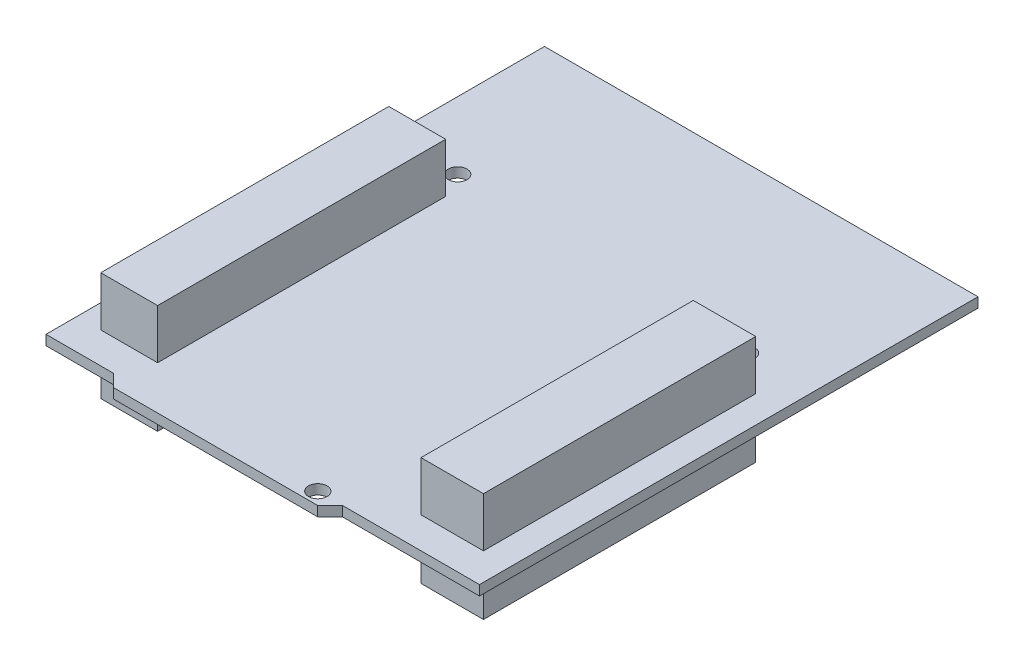
ISO-10303-21;
HEADER;
FILE_DESCRIPTION(('STEP AP214'),'2;1');
FILE_NAME('part.step','',(''),(''),'','','');
FILE_SCHEMA(('AUTOMOTIVE_DESIGN { 1 0 10303 214 1 1 1 1 }'));
ENDSEC;
DATA;
#1=APPLICATION_CONTEXT('core data for automotive mechanical design processes');
#2=APPLICATION_PROTOCOL_DEFINITION('international standard','automotive_design',2000,#1);
#3=PRODUCT_CONTEXT('',#1,'mechanical');
#4=PRODUCT('Part','Part','',(#3));
#5=PRODUCT_RELATED_PRODUCT_CATEGORY('part','',(#4));
#6=PRODUCT_DEFINITION_FORMATION('','',#4);
#7=PRODUCT_DEFINITION_CONTEXT('part definition',#1,'design');
#8=PRODUCT_DEFINITION('design','',#6,#7);
#9=PRODUCT_DEFINITION_SHAPE('','',#8);
#10=(LENGTH_UNIT() NAMED_UNIT(*) SI_UNIT(.MILLI.,.METRE.));
#11=(NAMED_UNIT(*) PLANE_ANGLE_UNIT() SI_UNIT($,.RADIAN.));
#12=(NAMED_UNIT(*) SI_UNIT($,.STERADIAN.) SOLID_ANGLE_UNIT());
#13=UNCERTAINTY_MEASURE_WITH_UNIT(LENGTH_MEASURE(1.E-05),#10,'distance_accuracy_value','');
#14=(GEOMETRIC_REPRESENTATION_CONTEXT(3) GLOBAL_UNCERTAINTY_ASSIGNED_CONTEXT((#13)) GLOBAL_UNIT_ASSIGNED_CONTEXT((#10,
#11,#12)) REPRESENTATION_CONTEXT('',''));
#15=CARTESIAN_POINT('',(0.,0.,0.));
#16=DIRECTION('',(0.,0.,1.));
#17=DIRECTION('',(1.,0.,0.));
#18=AXIS2_PLACEMENT_3D('',#15,#16,#17);
#19=CARTESIAN_POINT('',(0.,1.6,0.));
#20=DIRECTION('',(0.,-1.,0.));
#21=DIRECTION('',(0.,0.,-1.));
#22=AXIS2_PLACEMENT_3D('',#19,#20,#21);
#23=PLANE('',#22);
#24=DIRECTION('',(-1.,0.,0.));
#25=VECTOR('',#24,1.);
#26=CARTESIAN_POINT('',(0.,1.6,-51.5438957426682));
#27=LINE('',#26,#25);
#28=CARTESIAN_POINT('',(12.9919135906107,1.6,-51.5438957426682));
#29=VERTEX_POINT('',#28);
#30=CARTESIAN_POINT('',(3.81246012909742,1.6,-51.5438957426682));
#31=VERTEX_POINT('',#30);
#32=EDGE_CURVE('E289',#29,#31,#27,.T.);
#33=ORIENTED_EDGE('',*,*,#32,.F.);
#34=DIRECTION('',(0.,0.,-1.));
#35=VECTOR('',#34,1.);
#36=CARTESIAN_POINT('',(12.9919135906107,1.6,0.));
#37=LINE('',#36,#35);
#38=CARTESIAN_POINT('',(12.9919135906107,1.6,-5.03112271445616));
#39=VERTEX_POINT('',#38);
#40=EDGE_CURVE('E287',#39,#29,#37,.T.);
#41=ORIENTED_EDGE('',*,*,#40,.F.);
#42=DIRECTION('',(-1.,0.,0.));
#43=VECTOR('',#42,1.);
#44=CARTESIAN_POINT('',(0.,1.6,-5.03112271445616));
#45=LINE('',#44,#43);
#46=CARTESIAN_POINT('',(3.81246012909742,1.6,-5.03112271445616));
#47=VERTEX_POINT('',#46);
#48=EDGE_CURVE('E284',#39,#47,#45,.T.);
#49=ORIENTED_EDGE('',*,*,#48,.T.);
#50=DIRECTION('',(0.,0.,-1.));
#51=VECTOR('',#50,1.);
#52=CARTESIAN_POINT('',(3.81246012909742,1.6,0.));
#53=LINE('',#52,#51);
#54=EDGE_CURVE('E281',#47,#31,#53,.T.);
#55=ORIENTED_EDGE('',*,*,#54,.T.);
#56=EDGE_LOOP('',(#33,#41,#49,#55));
#57=FACE_BOUND('',#56,.T.);
#58=CARTESIAN_POINT('',(59.13,1.6,-53.84));
#59=DIRECTION('',(0.,1.,0.));
#60=DIRECTION('',(0.,0.,1.));
#61=AXIS2_PLACEMENT_3D('',#58,#59,#60);
#62=CIRCLE('',#61,1.5);
#63=CARTESIAN_POINT('',(59.13,1.6,-52.34));
#64=VERTEX_POINT('',#63);
#65=EDGE_CURVE('E299',#64,#64,#62,.T.);
#66=ORIENTED_EDGE('',*,*,#65,.F.);
#67=EDGE_LOOP('',(#66));
#68=FACE_BOUND('',#67,.T.);
#69=DIRECTION('',(0.,0.,-1.));
#70=VECTOR('',#69,1.);
#71=CARTESIAN_POINT('',(70.,1.6,0.));
#72=LINE('',#71,#70);
#73=CARTESIAN_POINT('',(70.,1.6,0.));
#74=VERTEX_POINT('',#73);
#75=CARTESIAN_POINT('',(70.,1.6,-80.5));
#76=VERTEX_POINT('',#75);
#77=EDGE_CURVE('E311',#74,#76,#72,.T.);
#78=ORIENTED_EDGE('',*,*,#77,.T.);
#79=DIRECTION('',(-1.,0.,0.));
#80=VECTOR('',#79,1.);
#81=CARTESIAN_POINT('',(0.,1.6,-80.5));
#82=LINE('',#81,#80);
#83=CARTESIAN_POINT('',(0.,1.6,-80.5));
#84=VERTEX_POINT('',#83);
#85=EDGE_CURVE('E314',#76,#84,#82,.T.);
#86=ORIENTED_EDGE('',*,*,#85,.T.);
#87=DIRECTION('',(0.,0.,1.));
#88=VECTOR('',#87,1.);
#89=CARTESIAN_POINT('',(0.,1.6,0.));
#90=LINE('',#89,#88);
#91=CARTESIAN_POINT('',(0.,1.6,0.));
#92=VERTEX_POINT('',#91);
#93=EDGE_CURVE('E317',#84,#92,#90,.T.);
#94=ORIENTED_EDGE('',*,*,#93,.T.);
#95=DIRECTION('',(1.,0.,0.));
#96=VECTOR('',#95,1.);
#97=CARTESIAN_POINT('',(0.,1.6,0.));
#98=LINE('',#97,#96);
#99=CARTESIAN_POINT('',(10.87,1.6,0.));
#100=VERTEX_POINT('',#99);
#101=EDGE_CURVE('E319',#92,#100,#98,.T.);
#102=ORIENTED_EDGE('',*,*,#101,.T.);
#103=DIRECTION('',(0.707106781186545,0.,0.70710678118655));
#104=VECTOR('',#103,1.);
#105=CARTESIAN_POINT('',(10.87,1.6,0.));
#106=LINE('',#105,#104);
#107=CARTESIAN_POINT('',(12.87,1.6,2.));
#108=VERTEX_POINT('',#107);
#109=EDGE_CURVE('E321',#100,#108,#106,.T.);
#110=ORIENTED_EDGE('',*,*,#109,.T.);
#111=DIRECTION('',(1.,0.,0.));
#112=VECTOR('',#111,1.);
#113=CARTESIAN_POINT('',(12.87,1.6,2.));
#114=LINE('',#113,#112);
#115=CARTESIAN_POINT('',(45.87,1.6,2.));
#116=VERTEX_POINT('',#115);
#117=EDGE_CURVE('E323',#108,#116,#114,.T.);
#118=ORIENTED_EDGE('',*,*,#117,.T.);
#119=DIRECTION('',(0.707106781186545,0.,-0.70710678118655));
#120=VECTOR('',#119,1.);
#121=CARTESIAN_POINT('',(45.87,1.6,2.));
#122=LINE('',#121,#120);
#123=CARTESIAN_POINT('',(47.87,1.6,0.));
#124=VERTEX_POINT('',#123);
#125=EDGE_CURVE('E325',#116,#124,#122,.T.);
#126=ORIENTED_EDGE('',*,*,#125,.T.);
#127=DIRECTION('',(1.,0.,0.));
#128=VECTOR('',#127,1.);
#129=CARTESIAN_POINT('',(47.87,1.6,0.));
#130=LINE('',#129,#128);
#131=EDGE_CURVE('E327',#124,#74,#130,.T.);
#132=ORIENTED_EDGE('',*,*,#131,.T.);
#133=EDGE_LOOP('',(#78,#86,#94,#102,#110,#118,#126,#132));
#134=FACE_BOUND('',#133,.T.);
#135=CARTESIAN_POINT('',(10.87,1.6,-55.61));
#136=DIRECTION('',(0.,1.,0.));
#137=DIRECTION('',(0.,0.,1.));
#138=AXIS2_PLACEMENT_3D('',#135,#136,#137);
#139=CIRCLE('',#138,1.5);
#140=CARTESIAN_POINT('',(10.87,1.6,-54.11));
#141=VERTEX_POINT('',#140);
#142=EDGE_CURVE('E305',#141,#141,#139,.T.);
#143=ORIENTED_EDGE('',*,*,#142,.F.);
#144=EDGE_LOOP('',(#143));
#145=FACE_BOUND('',#144,.T.);
#146=CARTESIAN_POINT('',(43.89,1.6,0.));
#147=DIRECTION('',(0.,1.,0.));
#148=DIRECTION('',(0.,0.,1.));
#149=AXIS2_PLACEMENT_3D('',#146,#147,#148);
#150=CIRCLE('',#149,1.5);
#151=CARTESIAN_POINT('',(43.89,1.6,1.5));
#152=VERTEX_POINT('',#151);
#153=EDGE_CURVE('E293',#152,#152,#150,.T.);
#154=ORIENTED_EDGE('',*,*,#153,.F.);
#155=EDGE_LOOP('',(#154));
#156=FACE_BOUND('',#155,.T.);
#157=DIRECTION('',(-1.,0.,0.));
#158=VECTOR('',#157,1.);
#159=CARTESIAN_POINT('',(0.,1.6,-49.000913342411));
#160=LINE('',#159,#158);
#161=CARTESIAN_POINT('',(65.608264327409,1.6,-49.000913342411));
#162=VERTEX_POINT('',#161);
#163=CARTESIAN_POINT('',(55.5272441217767,1.6,-49.000913342411));
#164=VERTEX_POINT('',#163);
#165=EDGE_CURVE('E240',#162,#164,#160,.T.);
#166=ORIENTED_EDGE('',*,*,#165,.F.);
#167=DIRECTION('',(0.,0.,-1.));
#168=VECTOR('',#167,1.);
#169=CARTESIAN_POINT('',(65.608264327409,1.6,0.));
#170=LINE('',#169,#168);
#171=CARTESIAN_POINT('',(65.608264327409,1.6,-5.03112271445616));
#172=VERTEX_POINT('',#171);
#173=EDGE_CURVE('E238',#172,#162,#170,.T.);
#174=ORIENTED_EDGE('',*,*,#173,.F.);
#175=DIRECTION('',(-1.,0.,0.));
#176=VECTOR('',#175,1.);
#177=CARTESIAN_POINT('',(0.,1.6,-5.03112271445616));
#178=LINE('',#177,#176);
#179=CARTESIAN_POINT('',(55.5272441217767,1.6,-5.03112271445616));
#180=VERTEX_POINT('',#179);
#181=EDGE_CURVE('E235',#172,#180,#178,.T.);
#182=ORIENTED_EDGE('',*,*,#181,.T.);
#183=DIRECTION('',(0.,0.,-1.));
#184=VECTOR('',#183,1.);
#185=CARTESIAN_POINT('',(55.5272441217767,1.6,0.));
#186=LINE('',#185,#184);
#187=EDGE_CURVE('E232',#180,#164,#186,.T.);
#188=ORIENTED_EDGE('',*,*,#187,.T.);
#189=EDGE_LOOP('',(#166,#174,#182,#188));
#190=FACE_BOUND('',#189,.T.);
#191=ADVANCED_FACE('F33',(#57,#68,#134,#145,#156,#190),#23,.F.);
#192=CARTESIAN_POINT('',(0.,0.,0.));
#193=DIRECTION('',(0.,-1.,0.));
#194=DIRECTION('',(0.,0.,-1.));
#195=AXIS2_PLACEMENT_3D('',#192,#193,#194);
#196=PLANE('',#195);
#197=DIRECTION('',(0.,0.,-1.));
#198=VECTOR('',#197,1.);
#199=CARTESIAN_POINT('',(12.9919135906107,0.,0.));
#200=LINE('',#199,#198);
#201=CARTESIAN_POINT('',(12.9919135906107,0.,-5.03112271445616));
#202=VERTEX_POINT('',#201);
#203=CARTESIAN_POINT('',(12.9919135906107,0.,-51.5438957426682));
#204=VERTEX_POINT('',#203);
#205=EDGE_CURVE('E374',#202,#204,#200,.T.);
#206=ORIENTED_EDGE('',*,*,#205,.T.);
#207=DIRECTION('',(-1.,0.,0.));
#208=VECTOR('',#207,1.);
#209=CARTESIAN_POINT('',(0.,0.,-51.5438957426682));
#210=LINE('',#209,#208);
#211=CARTESIAN_POINT('',(3.81246012909742,0.,-51.5438957426682));
#212=VERTEX_POINT('',#211);
#213=EDGE_CURVE('E376',#204,#212,#210,.T.);
#214=ORIENTED_EDGE('',*,*,#213,.T.);
#215=DIRECTION('',(0.,0.,-1.));
#216=VECTOR('',#215,1.);
#217=CARTESIAN_POINT('',(3.81246012909742,0.,0.));
#218=LINE('',#217,#216);
#219=CARTESIAN_POINT('',(3.81246012909742,0.,-5.03112271445616));
#220=VERTEX_POINT('',#219);
#221=EDGE_CURVE('E368',#220,#212,#218,.T.);
#222=ORIENTED_EDGE('',*,*,#221,.F.);
#223=DIRECTION('',(-1.,0.,0.));
#224=VECTOR('',#223,1.);
#225=CARTESIAN_POINT('',(0.,0.,-5.03112271445616));
#226=LINE('',#225,#224);
#227=EDGE_CURVE('E371',#202,#220,#226,.T.);
#228=ORIENTED_EDGE('',*,*,#227,.F.);
#229=EDGE_LOOP('',(#206,#214,#222,#228));
#230=FACE_BOUND('',#229,.T.);
#231=CARTESIAN_POINT('',(59.13,0.,-53.84));
#232=DIRECTION('',(0.,1.,0.));
#233=DIRECTION('',(0.,0.,1.));
#234=AXIS2_PLACEMENT_3D('',#231,#232,#233);
#235=CIRCLE('',#234,1.5);
#236=CARTESIAN_POINT('',(59.13,0.,-52.34));
#237=VERTEX_POINT('',#236);
#238=EDGE_CURVE('E296',#237,#237,#235,.T.);
#239=ORIENTED_EDGE('',*,*,#238,.T.);
#240=EDGE_LOOP('',(#239));
#241=FACE_BOUND('',#240,.T.);
#242=DIRECTION('',(0.,0.,-1.));
#243=VECTOR('',#242,1.);
#244=CARTESIAN_POINT('',(70.,0.,0.));
#245=LINE('',#244,#243);
#246=CARTESIAN_POINT('',(70.,0.,0.));
#247=VERTEX_POINT('',#246);
#248=CARTESIAN_POINT('',(70.,0.,-80.5));
#249=VERTEX_POINT('',#248);
#250=EDGE_CURVE('E308',#247,#249,#245,.T.);
#251=ORIENTED_EDGE('',*,*,#250,.F.);
#252=DIRECTION('',(1.,0.,0.));
#253=VECTOR('',#252,1.);
#254=CARTESIAN_POINT('',(47.87,0.,0.));
#255=LINE('',#254,#253);
#256=CARTESIAN_POINT('',(47.87,0.,0.));
#257=VERTEX_POINT('',#256);
#258=EDGE_CURVE('E315',#257,#247,#255,.T.);
#259=ORIENTED_EDGE('',*,*,#258,.F.);
#260=DIRECTION('',(0.707106781186545,0.,-0.70710678118655));
#261=VECTOR('',#260,1.);
#262=CARTESIAN_POINT('',(45.87,0.,2.));
#263=LINE('',#262,#261);
#264=CARTESIAN_POINT('',(45.87,0.,2.));
#265=VERTEX_POINT('',#264);
#266=EDGE_CURVE('E342',#265,#257,#263,.T.);
#267=ORIENTED_EDGE('',*,*,#266,.F.);
#268=DIRECTION('',(1.,0.,0.));
#269=VECTOR('',#268,1.);
#270=CARTESIAN_POINT('',(12.87,0.,2.));
#271=LINE('',#270,#269);
#272=CARTESIAN_POINT('',(12.87,0.,2.));
#273=VERTEX_POINT('',#272);
#274=EDGE_CURVE('E340',#273,#265,#271,.T.);
#275=ORIENTED_EDGE('',*,*,#274,.F.);
#276=DIRECTION('',(0.707106781186545,0.,0.70710678118655));
#277=VECTOR('',#276,1.);
#278=CARTESIAN_POINT('',(10.87,0.,0.));
#279=LINE('',#278,#277);
#280=CARTESIAN_POINT('',(10.87,0.,0.));
#281=VERTEX_POINT('',#280);
#282=EDGE_CURVE('E338',#281,#273,#279,.T.);
#283=ORIENTED_EDGE('',*,*,#282,.F.);
#284=DIRECTION('',(1.,0.,0.));
#285=VECTOR('',#284,1.);
#286=CARTESIAN_POINT('',(0.,0.,0.));
#287=LINE('',#286,#285);
#288=CARTESIAN_POINT('',(0.,0.,0.));
#289=VERTEX_POINT('',#288);
#290=EDGE_CURVE('E336',#289,#281,#287,.T.);
#291=ORIENTED_EDGE('',*,*,#290,.F.);
#292=DIRECTION('',(0.,0.,1.));
#293=VECTOR('',#292,1.);
#294=CARTESIAN_POINT('',(0.,0.,0.));
#295=LINE('',#294,#293);
#296=CARTESIAN_POINT('',(0.,0.,-80.5));
#297=VERTEX_POINT('',#296);
#298=EDGE_CURVE('E334',#297,#289,#295,.T.);
#299=ORIENTED_EDGE('',*,*,#298,.F.);
#300=DIRECTION('',(-1.,0.,0.));
#301=VECTOR('',#300,1.);
#302=CARTESIAN_POINT('',(0.,0.,-80.5));
#303=LINE('',#302,#301);
#304=EDGE_CURVE('E332',#249,#297,#303,.T.);
#305=ORIENTED_EDGE('',*,*,#304,.F.);
#306=EDGE_LOOP('',(#251,#259,#267,#275,#283,#291,#299,#305));
#307=FACE_BOUND('',#306,.T.);
#308=CARTESIAN_POINT('',(10.87,0.,-55.61));
#309=DIRECTION('',(0.,1.,0.));
#310=DIRECTION('',(0.,0.,1.));
#311=AXIS2_PLACEMENT_3D('',#308,#309,#310);
#312=CIRCLE('',#311,1.5);
#313=CARTESIAN_POINT('',(10.87,0.,-54.11));
#314=VERTEX_POINT('',#313);
#315=EDGE_CURVE('E302',#314,#314,#312,.T.);
#316=ORIENTED_EDGE('',*,*,#315,.T.);
#317=EDGE_LOOP('',(#316));
#318=FACE_BOUND('',#317,.T.);
#319=CARTESIAN_POINT('',(43.89,0.,0.));
#320=DIRECTION('',(0.,1.,0.));
#321=DIRECTION('',(0.,0.,1.));
#322=AXIS2_PLACEMENT_3D('',#319,#320,#321);
#323=CIRCLE('',#322,1.5);
#324=CARTESIAN_POINT('',(43.89,0.,1.5));
#325=VERTEX_POINT('',#324);
#326=EDGE_CURVE('E292',#325,#325,#323,.T.);
#327=ORIENTED_EDGE('',*,*,#326,.T.);
#328=EDGE_LOOP('',(#327));
#329=FACE_BOUND('',#328,.T.);
#330=DIRECTION('',(0.,0.,-1.));
#331=VECTOR('',#330,1.);
#332=CARTESIAN_POINT('',(65.608264327409,0.,0.));
#333=LINE('',#332,#331);
#334=CARTESIAN_POINT('',(65.608264327409,0.,-5.03112271445616));
#335=VERTEX_POINT('',#334);
#336=CARTESIAN_POINT('',(65.608264327409,0.,-49.000913342411));
#337=VERTEX_POINT('',#336);
#338=EDGE_CURVE('E41',#335,#337,#333,.T.);
#339=ORIENTED_EDGE('',*,*,#338,.T.);
#340=DIRECTION('',(-1.,0.,0.));
#341=VECTOR('',#340,1.);
#342=CARTESIAN_POINT('',(0.,0.,-49.000913342411));
#343=LINE('',#342,#341);
#344=CARTESIAN_POINT('',(55.5272441217767,0.,-49.000913342411));
#345=VERTEX_POINT('',#344);
#346=EDGE_CURVE('E11',#337,#345,#343,.T.);
#347=ORIENTED_EDGE('',*,*,#346,.T.);
#348=DIRECTION('',(0.,0.,-1.));
#349=VECTOR('',#348,1.);
#350=CARTESIAN_POINT('',(55.5272441217767,0.,0.));
#351=LINE('',#350,#349);
#352=CARTESIAN_POINT('',(55.5272441217767,0.,-5.03112271445616));
#353=VERTEX_POINT('',#352);
#354=EDGE_CURVE('E199',#353,#345,#351,.T.);
#355=ORIENTED_EDGE('',*,*,#354,.F.);
#356=DIRECTION('',(-1.,0.,0.));
#357=VECTOR('',#356,1.);
#358=CARTESIAN_POINT('',(0.,0.,-5.03112271445616));
#359=LINE('',#358,#357);
#360=EDGE_CURVE('E379',#335,#353,#359,.T.);
#361=ORIENTED_EDGE('',*,*,#360,.F.);
#362=EDGE_LOOP('',(#339,#347,#355,#361));
#363=FACE_BOUND('',#362,.T.);
#364=ADVANCED_FACE('F412',(#230,#241,#307,#318,#329,#363),#196,.T.);
#365=CARTESIAN_POINT('',(70.,1.6,0.));
#366=DIRECTION('',(-1.,0.,0.));
#367=DIRECTION('',(0.,0.,1.));
#368=AXIS2_PLACEMENT_3D('',#365,#366,#367);
#369=PLANE('',#368);
#370=ORIENTED_EDGE('',*,*,#250,.T.);
#371=DIRECTION('',(0.,-1.,0.));
#372=VECTOR('',#371,1.);
#373=CARTESIAN_POINT('',(70.,1.6,-80.5));
#374=LINE('',#373,#372);
#375=EDGE_CURVE('E365',#76,#249,#374,.T.);
#376=ORIENTED_EDGE('',*,*,#375,.F.);
#377=ORIENTED_EDGE('',*,*,#77,.F.);
#378=DIRECTION('',(0.,-1.,0.));
#379=VECTOR('',#378,1.);
#380=CARTESIAN_POINT('',(70.,1.6,0.));
#381=LINE('',#380,#379);
#382=EDGE_CURVE('E329',#74,#247,#381,.T.);
#383=ORIENTED_EDGE('',*,*,#382,.T.);
#384=EDGE_LOOP('',(#370,#376,#377,#383));
#385=FACE_BOUND('',#384,.T.);
#386=ADVANCED_FACE('F35',(#385),#369,.F.);
#387=CARTESIAN_POINT('',(0.,1.6,-80.5));
#388=DIRECTION('',(0.,0.,1.));
#389=DIRECTION('',(1.,0.,0.));
#390=AXIS2_PLACEMENT_3D('',#387,#388,#389);
#391=PLANE('',#390);
#392=ORIENTED_EDGE('',*,*,#304,.T.);
#393=DIRECTION('',(0.,-1.,0.));
#394=VECTOR('',#393,1.);
#395=CARTESIAN_POINT('',(0.,1.6,-80.5));
#396=LINE('',#395,#394);
#397=EDGE_CURVE('E362',#84,#297,#396,.T.);
#398=ORIENTED_EDGE('',*,*,#397,.F.);
#399=ORIENTED_EDGE('',*,*,#85,.F.);
#400=ORIENTED_EDGE('',*,*,#375,.T.);
#401=EDGE_LOOP('',(#392,#398,#399,#400));
#402=FACE_BOUND('',#401,.T.);
#403=ADVANCED_FACE('F448',(#402),#391,.F.);
#404=CARTESIAN_POINT('',(0.,1.6,0.));
#405=DIRECTION('',(1.,0.,0.));
#406=DIRECTION('',(0.,0.,-1.));
#407=AXIS2_PLACEMENT_3D('',#404,#405,#406);
#408=PLANE('',#407);
#409=ORIENTED_EDGE('',*,*,#298,.T.);
#410=DIRECTION('',(0.,-1.,0.));
#411=VECTOR('',#410,1.);
#412=CARTESIAN_POINT('',(0.,1.6,0.));
#413=LINE('',#412,#411);
#414=EDGE_CURVE('E359',#92,#289,#413,.T.);
#415=ORIENTED_EDGE('',*,*,#414,.F.);
#416=ORIENTED_EDGE('',*,*,#93,.F.);
#417=ORIENTED_EDGE('',*,*,#397,.T.);
#418=EDGE_LOOP('',(#409,#415,#416,#417));
#419=FACE_BOUND('',#418,.T.);
#420=ADVANCED_FACE('F445',(#419),#408,.F.);
#421=CARTESIAN_POINT('',(0.,1.6,0.));
#422=DIRECTION('',(0.,0.,-1.));
#423=DIRECTION('',(-1.,0.,0.));
#424=AXIS2_PLACEMENT_3D('',#421,#422,#423);
#425=PLANE('',#424);
#426=ORIENTED_EDGE('',*,*,#290,.T.);
#427=DIRECTION('',(0.,-1.,0.));
#428=VECTOR('',#427,1.);
#429=CARTESIAN_POINT('',(10.87,1.6,0.));
#430=LINE('',#429,#428);
#431=EDGE_CURVE('E356',#100,#281,#430,.T.);
#432=ORIENTED_EDGE('',*,*,#431,.F.);
#433=ORIENTED_EDGE('',*,*,#101,.F.);
#434=ORIENTED_EDGE('',*,*,#414,.T.);
#435=EDGE_LOOP('',(#426,#432,#433,#434));
#436=FACE_BOUND('',#435,.T.);
#437=ADVANCED_FACE('F441',(#436),#425,.F.);
#438=CARTESIAN_POINT('',(10.87,1.6,0.));
#439=DIRECTION('',(0.70710678118655,0.,-0.707106781186545));
#440=DIRECTION('',(-0.707106781186545,0.,-0.70710678118655));
#441=AXIS2_PLACEMENT_3D('',#438,#439,#440);
#442=PLANE('',#441);
#443=ORIENTED_EDGE('',*,*,#282,.T.);
#444=DIRECTION('',(0.,-1.,0.));
#445=VECTOR('',#444,1.);
#446=CARTESIAN_POINT('',(12.87,1.6,2.));
#447=LINE('',#446,#445);
#448=EDGE_CURVE('E353',#108,#273,#447,.T.);
#449=ORIENTED_EDGE('',*,*,#448,.F.);
#450=ORIENTED_EDGE('',*,*,#109,.F.);
#451=ORIENTED_EDGE('',*,*,#431,.T.);
#452=EDGE_LOOP('',(#443,#449,#450,#451));
#453=FACE_BOUND('',#452,.T.);
#454=ADVANCED_FACE('F437',(#453),#442,.F.);
#455=CARTESIAN_POINT('',(12.87,1.6,2.));
#456=DIRECTION('',(0.,0.,-1.));
#457=DIRECTION('',(-1.,0.,0.));
#458=AXIS2_PLACEMENT_3D('',#455,#456,#457);
#459=PLANE('',#458);
#460=ORIENTED_EDGE('',*,*,#274,.T.);
#461=DIRECTION('',(0.,-1.,0.));
#462=VECTOR('',#461,1.);
#463=CARTESIAN_POINT('',(45.87,1.6,2.));
#464=LINE('',#463,#462);
#465=EDGE_CURVE('E350',#116,#265,#464,.T.);
#466=ORIENTED_EDGE('',*,*,#465,.F.);
#467=ORIENTED_EDGE('',*,*,#117,.F.);
#468=ORIENTED_EDGE('',*,*,#448,.T.);
#469=EDGE_LOOP('',(#460,#466,#467,#468));
#470=FACE_BOUND('',#469,.T.);
#471=ADVANCED_FACE('F433',(#470),#459,.F.);
#472=CARTESIAN_POINT('',(45.87,1.6,2.));
#473=DIRECTION('',(-0.70710678118655,0.,-0.707106781186545));
#474=DIRECTION('',(-0.707106781186545,0.,0.70710678118655));
#475=AXIS2_PLACEMENT_3D('',#472,#473,#474);
#476=PLANE('',#475);
#477=ORIENTED_EDGE('',*,*,#266,.T.);
#478=DIRECTION('',(0.,-1.,0.));
#479=VECTOR('',#478,1.);
#480=CARTESIAN_POINT('',(47.87,1.6,0.));
#481=LINE('',#480,#479);
#482=EDGE_CURVE('E347',#124,#257,#481,.T.);
#483=ORIENTED_EDGE('',*,*,#482,.F.);
#484=ORIENTED_EDGE('',*,*,#125,.F.);
#485=ORIENTED_EDGE('',*,*,#465,.T.);
#486=EDGE_LOOP('',(#477,#483,#484,#485));
#487=FACE_BOUND('',#486,.T.);
#488=ADVANCED_FACE('F429',(#487),#476,.F.);
#489=CARTESIAN_POINT('',(47.87,1.6,0.));
#490=DIRECTION('',(0.,0.,-1.));
#491=DIRECTION('',(-1.,0.,0.));
#492=AXIS2_PLACEMENT_3D('',#489,#490,#491);
#493=PLANE('',#492);
#494=ORIENTED_EDGE('',*,*,#258,.T.);
#495=ORIENTED_EDGE('',*,*,#382,.F.);
#496=ORIENTED_EDGE('',*,*,#131,.F.);
#497=ORIENTED_EDGE('',*,*,#482,.T.);
#498=EDGE_LOOP('',(#494,#495,#496,#497));
#499=FACE_BOUND('',#498,.T.);
#500=ADVANCED_FACE('F426',(#499),#493,.F.);
#501=CARTESIAN_POINT('',(10.87,1.6,-55.61));
#502=DIRECTION('',(0.,-1.,0.));
#503=DIRECTION('',(0.,0.,-1.));
#504=AXIS2_PLACEMENT_3D('',#501,#502,#503);
#505=CYLINDRICAL_SURFACE('',#504,1.5);
#506=ORIENTED_EDGE('',*,*,#142,.T.);
#507=EDGE_LOOP('',(#506));
#508=FACE_BOUND('',#507,.T.);
#509=ORIENTED_EDGE('',*,*,#315,.F.);
#510=EDGE_LOOP('',(#509));
#511=FACE_BOUND('',#510,.T.);
#512=ADVANCED_FACE('F423',(#508,#511),#505,.F.);
#513=CARTESIAN_POINT('',(59.13,1.6,-53.84));
#514=DIRECTION('',(0.,-1.,0.));
#515=DIRECTION('',(0.,0.,-1.));
#516=AXIS2_PLACEMENT_3D('',#513,#514,#515);
#517=CYLINDRICAL_SURFACE('',#516,1.5);
#518=ORIENTED_EDGE('',*,*,#65,.T.);
#519=EDGE_LOOP('',(#518));
#520=FACE_BOUND('',#519,.T.);
#521=ORIENTED_EDGE('',*,*,#238,.F.);
#522=EDGE_LOOP('',(#521));
#523=FACE_BOUND('',#522,.T.);
#524=ADVANCED_FACE('F490',(#520,#523),#517,.F.);
#525=CARTESIAN_POINT('',(43.89,1.6,0.));
#526=DIRECTION('',(0.,-1.,0.));
#527=DIRECTION('',(0.,0.,-1.));
#528=AXIS2_PLACEMENT_3D('',#525,#526,#527);
#529=CYLINDRICAL_SURFACE('',#528,1.5);
#530=ORIENTED_EDGE('',*,*,#153,.T.);
#531=EDGE_LOOP('',(#530));
#532=FACE_BOUND('',#531,.T.);
#533=ORIENTED_EDGE('',*,*,#326,.F.);
#534=EDGE_LOOP('',(#533));
#535=FACE_BOUND('',#534,.T.);
#536=ADVANCED_FACE('F486',(#532,#535),#529,.F.);
#537=CARTESIAN_POINT('',(0.,-8.,0.));
#538=DIRECTION('',(0.,-1.,0.));
#539=DIRECTION('',(0.,0.,-1.));
#540=AXIS2_PLACEMENT_3D('',#537,#538,#539);
#541=PLANE('',#540);
#542=DIRECTION('',(1.,0.,0.));
#543=VECTOR('',#542,1.);
#544=CARTESIAN_POINT('',(3.81246012909742,-8.,-51.5438957426682));
#545=LINE('',#544,#543);
#546=CARTESIAN_POINT('',(3.81246012909742,-8.,-51.5438957426682));
#547=VERTEX_POINT('',#546);
#548=CARTESIAN_POINT('',(12.9919135906107,-8.,-51.5438957426682));
#549=VERTEX_POINT('',#548);
#550=EDGE_CURVE('E254',#547,#549,#545,.T.);
#551=ORIENTED_EDGE('',*,*,#550,.T.);
#552=DIRECTION('',(0.,0.,1.));
#553=VECTOR('',#552,1.);
#554=CARTESIAN_POINT('',(12.9919135906107,-8.,-51.5438957426682));
#555=LINE('',#554,#553);
#556=CARTESIAN_POINT('',(12.9919135906107,-8.,-5.03112271445616));
#557=VERTEX_POINT('',#556);
#558=EDGE_CURVE('E257',#549,#557,#555,.T.);
#559=ORIENTED_EDGE('',*,*,#558,.T.);
#560=DIRECTION('',(1.,0.,0.));
#561=VECTOR('',#560,1.);
#562=CARTESIAN_POINT('',(3.81246012909742,-8.,-5.03112271445616));
#563=LINE('',#562,#561);
#564=CARTESIAN_POINT('',(3.81246012909742,-8.,-5.03112271445616));
#565=VERTEX_POINT('',#564);
#566=EDGE_CURVE('E259',#565,#557,#563,.T.);
#567=ORIENTED_EDGE('',*,*,#566,.F.);
#568=DIRECTION('',(0.,0.,1.));
#569=VECTOR('',#568,1.);
#570=CARTESIAN_POINT('',(3.81246012909742,-8.,-51.5438957426682));
#571=LINE('',#570,#569);
#572=EDGE_CURVE('E262',#547,#565,#571,.T.);
#573=ORIENTED_EDGE('',*,*,#572,.F.);
#574=EDGE_LOOP('',(#551,#559,#567,#573));
#575=FACE_BOUND('',#574,.T.);
#576=ADVANCED_FACE('F489',(#575),#541,.T.);
#577=CARTESIAN_POINT('',(3.81246012909742,-8.,-51.5438957426682));
#578=DIRECTION('',(-1.,0.,0.));
#579=DIRECTION('',(0.,0.,1.));
#580=AXIS2_PLACEMENT_3D('',#577,#578,#579);
#581=PLANE('',#580);
#582=DIRECTION('',(0.,1.,0.));
#583=VECTOR('',#582,1.);
#584=CARTESIAN_POINT('',(3.81246012909742,-8.,-5.03112271445616));
#585=LINE('',#584,#583);
#586=EDGE_CURVE('E270',#565,#220,#585,.T.);
#587=ORIENTED_EDGE('',*,*,#586,.T.);
#588=ORIENTED_EDGE('',*,*,#221,.T.);
#589=DIRECTION('',(0.,1.,0.));
#590=VECTOR('',#589,1.);
#591=CARTESIAN_POINT('',(3.81246012909742,-8.,-51.5438957426682));
#592=LINE('',#591,#590);
#593=EDGE_CURVE('E266',#547,#212,#592,.T.);
#594=ORIENTED_EDGE('',*,*,#593,.F.);
#595=ORIENTED_EDGE('',*,*,#572,.T.);
#596=EDGE_LOOP('',(#587,#588,#594,#595));
#597=FACE_BOUND('',#596,.T.);
#598=ADVANCED_FACE('F498',(#597),#581,.T.);
#599=CARTESIAN_POINT('',(3.81246012909742,-8.,-5.03112271445616));
#600=DIRECTION('',(0.,0.,1.));
#601=DIRECTION('',(1.,0.,0.));
#602=AXIS2_PLACEMENT_3D('',#599,#600,#601);
#603=PLANE('',#602);
#604=DIRECTION('',(0.,1.,0.));
#605=VECTOR('',#604,1.);
#606=CARTESIAN_POINT('',(12.9919135906107,-8.,-5.03112271445616));
#607=LINE('',#606,#605);
#608=EDGE_CURVE('E274',#557,#202,#607,.T.);
#609=ORIENTED_EDGE('',*,*,#608,.T.);
#610=ORIENTED_EDGE('',*,*,#227,.T.);
#611=ORIENTED_EDGE('',*,*,#586,.F.);
#612=ORIENTED_EDGE('',*,*,#566,.T.);
#613=EDGE_LOOP('',(#609,#610,#611,#612));
#614=FACE_BOUND('',#613,.T.);
#615=ADVANCED_FACE('F511',(#614),#603,.T.);
#616=CARTESIAN_POINT('',(12.9919135906107,-8.,-51.5438957426682));
#617=DIRECTION('',(-1.,0.,0.));
#618=DIRECTION('',(0.,0.,1.));
#619=AXIS2_PLACEMENT_3D('',#616,#617,#618);
#620=PLANE('',#619);
#621=ORIENTED_EDGE('',*,*,#205,.F.);
#622=ORIENTED_EDGE('',*,*,#608,.F.);
#623=ORIENTED_EDGE('',*,*,#558,.F.);
#624=DIRECTION('',(0.,1.,0.));
#625=VECTOR('',#624,1.);
#626=CARTESIAN_POINT('',(12.9919135906107,-8.,-51.5438957426682));
#627=LINE('',#626,#625);
#628=EDGE_CURVE('E278',#549,#204,#627,.T.);
#629=ORIENTED_EDGE('',*,*,#628,.T.);
#630=EDGE_LOOP('',(#621,#622,#623,#629));
#631=FACE_BOUND('',#630,.T.);
#632=ADVANCED_FACE('F507',(#631),#620,.F.);
#633=CARTESIAN_POINT('',(3.81246012909742,-8.,-51.5438957426682));
#634=DIRECTION('',(0.,0.,1.));
#635=DIRECTION('',(1.,0.,0.));
#636=AXIS2_PLACEMENT_3D('',#633,#634,#635);
#637=PLANE('',#636);
#638=ORIENTED_EDGE('',*,*,#213,.F.);
#639=ORIENTED_EDGE('',*,*,#628,.F.);
#640=ORIENTED_EDGE('',*,*,#550,.F.);
#641=ORIENTED_EDGE('',*,*,#593,.T.);
#642=EDGE_LOOP('',(#638,#639,#640,#641));
#643=FACE_BOUND('',#642,.T.);
#644=ADVANCED_FACE('F503',(#643),#637,.F.);
#645=CARTESIAN_POINT('',(12.9919135906107,9.6,-51.5438957426682));
#646=VERTEX_POINT('',#645);
#647=EDGE_CURVE('E277',#29,#646,#627,.T.);
#648=ORIENTED_EDGE('',*,*,#647,.F.);
#649=ORIENTED_EDGE('',*,*,#32,.T.);
#650=CARTESIAN_POINT('',(3.81246012909742,9.6,-51.5438957426682));
#651=VERTEX_POINT('',#650);
#652=EDGE_CURVE('E265',#31,#651,#592,.T.);
#653=ORIENTED_EDGE('',*,*,#652,.T.);
#654=DIRECTION('',(1.,0.,0.));
#655=VECTOR('',#654,1.);
#656=CARTESIAN_POINT('',(3.81246012909742,9.6,-51.5438957426682));
#657=LINE('',#656,#655);
#658=EDGE_CURVE('E242',#651,#646,#657,.T.);
#659=ORIENTED_EDGE('',*,*,#658,.T.);
#660=EDGE_LOOP('',(#648,#649,#653,#659));
#661=FACE_BOUND('',#660,.T.);
#662=ADVANCED_FACE('F506',(#661),#637,.F.);
#663=CARTESIAN_POINT('',(12.9919135906107,9.6,-5.03112271445616));
#664=VERTEX_POINT('',#663);
#665=EDGE_CURVE('E273',#39,#664,#607,.T.);
#666=ORIENTED_EDGE('',*,*,#665,.F.);
#667=ORIENTED_EDGE('',*,*,#40,.T.);
#668=ORIENTED_EDGE('',*,*,#647,.T.);
#669=DIRECTION('',(0.,0.,1.));
#670=VECTOR('',#669,1.);
#671=CARTESIAN_POINT('',(12.9919135906107,9.6,-51.5438957426682));
#672=LINE('',#671,#670);
#673=EDGE_CURVE('E245',#646,#664,#672,.T.);
#674=ORIENTED_EDGE('',*,*,#673,.T.);
#675=EDGE_LOOP('',(#666,#667,#668,#674));
#676=FACE_BOUND('',#675,.T.);
#677=ADVANCED_FACE('F513',(#676),#620,.F.);
#678=ORIENTED_EDGE('',*,*,#48,.F.);
#679=ORIENTED_EDGE('',*,*,#665,.T.);
#680=DIRECTION('',(1.,0.,0.));
#681=VECTOR('',#680,1.);
#682=CARTESIAN_POINT('',(3.81246012909742,9.6,-5.03112271445616));
#683=LINE('',#682,#681);
#684=CARTESIAN_POINT('',(3.81246012909742,9.6,-5.03112271445616));
#685=VERTEX_POINT('',#684);
#686=EDGE_CURVE('E248',#685,#664,#683,.T.);
#687=ORIENTED_EDGE('',*,*,#686,.F.);
#688=EDGE_CURVE('E269',#47,#685,#585,.T.);
#689=ORIENTED_EDGE('',*,*,#688,.F.);
#690=EDGE_LOOP('',(#678,#679,#687,#689));
#691=FACE_BOUND('',#690,.T.);
#692=ADVANCED_FACE('F517',(#691),#603,.T.);
#693=ORIENTED_EDGE('',*,*,#54,.F.);
#694=ORIENTED_EDGE('',*,*,#688,.T.);
#695=DIRECTION('',(0.,0.,1.));
#696=VECTOR('',#695,1.);
#697=CARTESIAN_POINT('',(3.81246012909742,9.6,-51.5438957426682));
#698=LINE('',#697,#696);
#699=EDGE_CURVE('E251',#651,#685,#698,.T.);
#700=ORIENTED_EDGE('',*,*,#699,.F.);
#701=ORIENTED_EDGE('',*,*,#652,.F.);
#702=EDGE_LOOP('',(#693,#694,#700,#701));
#703=FACE_BOUND('',#702,.T.);
#704=ADVANCED_FACE('F520',(#703),#581,.T.);
#705=CARTESIAN_POINT('',(0.,9.6,0.));
#706=DIRECTION('',(0.,-1.,0.));
#707=DIRECTION('',(0.,0.,-1.));
#708=AXIS2_PLACEMENT_3D('',#705,#706,#707);
#709=PLANE('',#708);
#710=ORIENTED_EDGE('',*,*,#658,.F.);
#711=ORIENTED_EDGE('',*,*,#699,.T.);
#712=ORIENTED_EDGE('',*,*,#686,.T.);
#713=ORIENTED_EDGE('',*,*,#673,.F.);
#714=EDGE_LOOP('',(#710,#711,#712,#713));
#715=FACE_BOUND('',#714,.T.);
#716=ADVANCED_FACE('F522',(#715),#709,.F.);
#717=CARTESIAN_POINT('',(0.,-8.,0.));
#718=DIRECTION('',(0.,-1.,0.));
#719=DIRECTION('',(0.,0.,-1.));
#720=AXIS2_PLACEMENT_3D('',#717,#718,#719);
#721=PLANE('',#720);
#722=DIRECTION('',(1.,0.,0.));
#723=VECTOR('',#722,1.);
#724=CARTESIAN_POINT('',(55.5272441217767,-8.,-49.000913342411));
#725=LINE('',#724,#723);
#726=CARTESIAN_POINT('',(55.5272441217767,-8.,-49.000913342411));
#727=VERTEX_POINT('',#726);
#728=CARTESIAN_POINT('',(65.608264327409,-8.,-49.000913342411));
#729=VERTEX_POINT('',#728);
#730=EDGE_CURVE('E204',#727,#729,#725,.T.);
#731=ORIENTED_EDGE('',*,*,#730,.T.);
#732=DIRECTION('',(0.,0.,1.));
#733=VECTOR('',#732,1.);
#734=CARTESIAN_POINT('',(65.608264327409,-8.,-49.000913342411));
#735=LINE('',#734,#733);
#736=CARTESIAN_POINT('',(65.608264327409,-8.,-5.03112271445616));
#737=VERTEX_POINT('',#736);
#738=EDGE_CURVE('E210',#729,#737,#735,.T.);
#739=ORIENTED_EDGE('',*,*,#738,.T.);
#740=DIRECTION('',(1.,0.,0.));
#741=VECTOR('',#740,1.);
#742=CARTESIAN_POINT('',(55.5272441217767,-8.,-5.03112271445616));
#743=LINE('',#742,#741);
#744=CARTESIAN_POINT('',(55.5272441217767,-8.,-5.03112271445616));
#745=VERTEX_POINT('',#744);
#746=EDGE_CURVE('E215',#745,#737,#743,.T.);
#747=ORIENTED_EDGE('',*,*,#746,.F.);
#748=DIRECTION('',(0.,0.,1.));
#749=VECTOR('',#748,1.);
#750=CARTESIAN_POINT('',(55.5272441217767,-8.,-49.000913342411));
#751=LINE('',#750,#749);
#752=EDGE_CURVE('E198',#727,#745,#751,.T.);
#753=ORIENTED_EDGE('',*,*,#752,.F.);
#754=EDGE_LOOP('',(#731,#739,#747,#753));
#755=FACE_BOUND('',#754,.T.);
#756=ADVANCED_FACE('F213',(#755),#721,.T.);
#757=CARTESIAN_POINT('',(55.5272441217767,-8.,-49.000913342411));
#758=DIRECTION('',(-1.,0.,0.));
#759=DIRECTION('',(0.,0.,1.));
#760=AXIS2_PLACEMENT_3D('',#757,#758,#759);
#761=PLANE('',#760);
#762=DIRECTION('',(0.,1.,0.));
#763=VECTOR('',#762,1.);
#764=CARTESIAN_POINT('',(55.5272441217767,-8.,-5.03112271445616));
#765=LINE('',#764,#763);
#766=EDGE_CURVE('E384',#745,#353,#765,.T.);
#767=ORIENTED_EDGE('',*,*,#766,.T.);
#768=ORIENTED_EDGE('',*,*,#354,.T.);
#769=DIRECTION('',(0.,1.,0.));
#770=VECTOR('',#769,1.);
#771=CARTESIAN_POINT('',(55.5272441217767,-8.,-49.000913342411));
#772=LINE('',#771,#770);
#773=EDGE_CURVE('E193',#727,#345,#772,.T.);
#774=ORIENTED_EDGE('',*,*,#773,.F.);
#775=ORIENTED_EDGE('',*,*,#752,.T.);
#776=EDGE_LOOP('',(#767,#768,#774,#775));
#777=FACE_BOUND('',#776,.T.);
#778=ADVANCED_FACE('F196',(#777),#761,.T.);
#779=CARTESIAN_POINT('',(55.5272441217767,-8.,-5.03112271445616));
#780=DIRECTION('',(0.,0.,1.));
#781=DIRECTION('',(1.,0.,0.));
#782=AXIS2_PLACEMENT_3D('',#779,#780,#781);
#783=PLANE('',#782);
#784=DIRECTION('',(0.,1.,0.));
#785=VECTOR('',#784,1.);
#786=CARTESIAN_POINT('',(65.608264327409,-8.,-5.03112271445616));
#787=LINE('',#786,#785);
#788=EDGE_CURVE('E386',#737,#335,#787,.T.);
#789=ORIENTED_EDGE('',*,*,#788,.T.);
#790=ORIENTED_EDGE('',*,*,#360,.T.);
#791=ORIENTED_EDGE('',*,*,#766,.F.);
#792=ORIENTED_EDGE('',*,*,#746,.T.);
#793=EDGE_LOOP('',(#789,#790,#791,#792));
#794=FACE_BOUND('',#793,.T.);
#795=ADVANCED_FACE('F383',(#794),#783,.T.);
#796=CARTESIAN_POINT('',(65.608264327409,-8.,-49.000913342411));
#797=DIRECTION('',(-1.,0.,0.));
#798=DIRECTION('',(0.,0.,1.));
#799=AXIS2_PLACEMENT_3D('',#796,#797,#798);
#800=PLANE('',#799);
#801=ORIENTED_EDGE('',*,*,#338,.F.);
#802=ORIENTED_EDGE('',*,*,#788,.F.);
#803=ORIENTED_EDGE('',*,*,#738,.F.);
#804=DIRECTION('',(0.,1.,0.));
#805=VECTOR('',#804,1.);
#806=CARTESIAN_POINT('',(65.608264327409,-8.,-49.000913342411));
#807=LINE('',#806,#805);
#808=EDGE_CURVE('E207',#729,#337,#807,.T.);
#809=ORIENTED_EDGE('',*,*,#808,.T.);
#810=EDGE_LOOP('',(#801,#802,#803,#809));
#811=FACE_BOUND('',#810,.T.);
#812=ADVANCED_FACE('F534',(#811),#800,.F.);
#813=CARTESIAN_POINT('',(55.5272441217767,-8.,-49.000913342411));
#814=DIRECTION('',(0.,0.,1.));
#815=DIRECTION('',(1.,0.,0.));
#816=AXIS2_PLACEMENT_3D('',#813,#814,#815);
#817=PLANE('',#816);
#818=ORIENTED_EDGE('',*,*,#346,.F.);
#819=ORIENTED_EDGE('',*,*,#808,.F.);
#820=ORIENTED_EDGE('',*,*,#730,.F.);
#821=ORIENTED_EDGE('',*,*,#773,.T.);
#822=EDGE_LOOP('',(#818,#819,#820,#821));
#823=FACE_BOUND('',#822,.T.);
#824=ADVANCED_FACE('F205',(#823),#817,.F.);
#825=CARTESIAN_POINT('',(65.608264327409,9.6,-49.000913342411));
#826=VERTEX_POINT('',#825);
#827=EDGE_CURVE('E391',#162,#826,#807,.T.);
#828=ORIENTED_EDGE('',*,*,#827,.F.);
#829=ORIENTED_EDGE('',*,*,#165,.T.);
#830=CARTESIAN_POINT('',(55.5272441217767,9.6,-49.000913342411));
#831=VERTEX_POINT('',#830);
#832=EDGE_CURVE('E48',#164,#831,#772,.T.);
#833=ORIENTED_EDGE('',*,*,#832,.T.);
#834=DIRECTION('',(1.,0.,0.));
#835=VECTOR('',#834,1.);
#836=CARTESIAN_POINT('',(55.5272441217767,9.6,-49.000913342411));
#837=LINE('',#836,#835);
#838=EDGE_CURVE('E229',#831,#826,#837,.T.);
#839=ORIENTED_EDGE('',*,*,#838,.T.);
#840=EDGE_LOOP('',(#828,#829,#833,#839));
#841=FACE_BOUND('',#840,.T.);
#842=ADVANCED_FACE('F405',(#841),#817,.F.);
#843=CARTESIAN_POINT('',(65.608264327409,9.6,-5.03112271445616));
#844=VERTEX_POINT('',#843);
#845=EDGE_CURVE('E390',#172,#844,#787,.T.);
#846=ORIENTED_EDGE('',*,*,#845,.F.);
#847=ORIENTED_EDGE('',*,*,#173,.T.);
#848=ORIENTED_EDGE('',*,*,#827,.T.);
#849=DIRECTION('',(0.,0.,1.));
#850=VECTOR('',#849,1.);
#851=CARTESIAN_POINT('',(65.608264327409,9.6,-49.000913342411));
#852=LINE('',#851,#850);
#853=EDGE_CURVE('E226',#826,#844,#852,.T.);
#854=ORIENTED_EDGE('',*,*,#853,.T.);
#855=EDGE_LOOP('',(#846,#847,#848,#854));
#856=FACE_BOUND('',#855,.T.);
#857=ADVANCED_FACE('F397',(#856),#800,.F.);
#858=ORIENTED_EDGE('',*,*,#181,.F.);
#859=ORIENTED_EDGE('',*,*,#845,.T.);
#860=DIRECTION('',(1.,0.,0.));
#861=VECTOR('',#860,1.);
#862=CARTESIAN_POINT('',(55.5272441217767,9.6,-5.03112271445616));
#863=LINE('',#862,#861);
#864=CARTESIAN_POINT('',(55.5272441217767,9.6,-5.03112271445616));
#865=VERTEX_POINT('',#864);
#866=EDGE_CURVE('E223',#865,#844,#863,.T.);
#867=ORIENTED_EDGE('',*,*,#866,.F.);
#868=EDGE_CURVE('E387',#180,#865,#765,.T.);
#869=ORIENTED_EDGE('',*,*,#868,.F.);
#870=EDGE_LOOP('',(#858,#859,#867,#869));
#871=FACE_BOUND('',#870,.T.);
#872=ADVANCED_FACE('F409',(#871),#783,.T.);
#873=ORIENTED_EDGE('',*,*,#187,.F.);
#874=ORIENTED_EDGE('',*,*,#868,.T.);
#875=DIRECTION('',(0.,0.,1.));
#876=VECTOR('',#875,1.);
#877=CARTESIAN_POINT('',(55.5272441217767,9.6,-49.000913342411));
#878=LINE('',#877,#876);
#879=EDGE_CURVE('E209',#831,#865,#878,.T.);
#880=ORIENTED_EDGE('',*,*,#879,.F.);
#881=ORIENTED_EDGE('',*,*,#832,.F.);
#882=EDGE_LOOP('',(#873,#874,#880,#881));
#883=FACE_BOUND('',#882,.T.);
#884=ADVANCED_FACE('F406',(#883),#761,.T.);
#885=CARTESIAN_POINT('',(0.,9.6,0.));
#886=DIRECTION('',(0.,-1.,0.));
#887=DIRECTION('',(0.,0.,-1.));
#888=AXIS2_PLACEMENT_3D('',#885,#886,#887);
#889=PLANE('',#888);
#890=ORIENTED_EDGE('',*,*,#838,.F.);
#891=ORIENTED_EDGE('',*,*,#879,.T.);
#892=ORIENTED_EDGE('',*,*,#866,.T.);
#893=ORIENTED_EDGE('',*,*,#853,.F.);
#894=EDGE_LOOP('',(#890,#891,#892,#893));
#895=FACE_BOUND('',#894,.T.);
#896=ADVANCED_FACE('F403',(#895),#889,.F.);
#897=CLOSED_SHELL('',(#191,#364,#386,#403,#420,#437,#454,#471,#488,#500,#512,#524,#536,#576,
#598,#615,#632,#644,#662,#677,#692,#704,#716,#756,#778,#795,#812,#824,#842,#857,#872,#884,#896));
#898=MANIFOLD_SOLID_BREP('B2',#897);
#899=ADVANCED_BREP_SHAPE_REPRESENTATION('',(#18,#898),#14);
#900=SHAPE_DEFINITION_REPRESENTATION(#9,#899);
ENDSEC;
END-ISO-10303-21;
